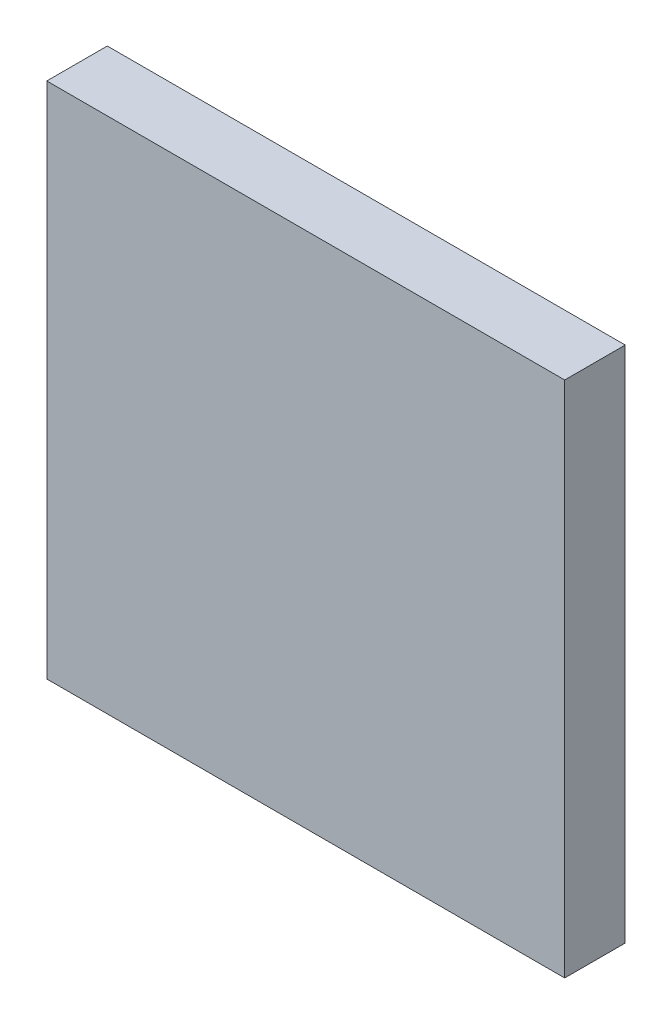
ISO-10303-21;
HEADER;
FILE_DESCRIPTION(('STEP AP214'),'2;1');
FILE_NAME('part.step','',(''),(''),'','','');
FILE_SCHEMA(('AUTOMOTIVE_DESIGN { 1 0 10303 214 1 1 1 1 }'));
ENDSEC;
DATA;
#1=APPLICATION_CONTEXT('core data for automotive mechanical design processes');
#2=APPLICATION_PROTOCOL_DEFINITION('international standard','automotive_design',2000,#1);
#3=PRODUCT_CONTEXT('',#1,'mechanical');
#4=PRODUCT('Part','Part','',(#3));
#5=PRODUCT_RELATED_PRODUCT_CATEGORY('part','',(#4));
#6=PRODUCT_DEFINITION_FORMATION('','',#4);
#7=PRODUCT_DEFINITION_CONTEXT('part definition',#1,'design');
#8=PRODUCT_DEFINITION('design','',#6,#7);
#9=PRODUCT_DEFINITION_SHAPE('','',#8);
#10=(LENGTH_UNIT() NAMED_UNIT(*) SI_UNIT(.MILLI.,.METRE.));
#11=(NAMED_UNIT(*) PLANE_ANGLE_UNIT() SI_UNIT($,.RADIAN.));
#12=(NAMED_UNIT(*) SI_UNIT($,.STERADIAN.) SOLID_ANGLE_UNIT());
#13=UNCERTAINTY_MEASURE_WITH_UNIT(LENGTH_MEASURE(1.E-05),#10,'distance_accuracy_value','');
#14=(GEOMETRIC_REPRESENTATION_CONTEXT(3) GLOBAL_UNCERTAINTY_ASSIGNED_CONTEXT((#13)) GLOBAL_UNIT_ASSIGNED_CONTEXT((#10,
#11,#12)) REPRESENTATION_CONTEXT('',''));
#15=CARTESIAN_POINT('',(0.,0.,0.));
#16=DIRECTION('',(0.,0.,1.));
#17=DIRECTION('',(1.,0.,0.));
#18=AXIS2_PLACEMENT_3D('',#15,#16,#17);
#19=CARTESIAN_POINT('',(-80.,-80.,1.7));
#20=DIRECTION('',(-1.,0.,0.));
#21=DIRECTION('',(0.,-1.,0.));
#22=AXIS2_PLACEMENT_3D('',#19,#20,#21);
#23=PLANE('',#22);
#24=DIRECTION('',(0.,1.,0.));
#25=VECTOR('',#24,1.);
#26=CARTESIAN_POINT('',(-80.,-80.,0.));
#27=LINE('',#26,#25);
#28=CARTESIAN_POINT('',(-80.,-80.,0.));
#29=VERTEX_POINT('',#28);
#30=CARTESIAN_POINT('',(-80.,80.,0.));
#31=VERTEX_POINT('',#30);
#32=EDGE_CURVE('E129',#29,#31,#27,.T.);
#33=ORIENTED_EDGE('',*,*,#32,.F.);
#34=DIRECTION('',(0.,0.,-1.));
#35=VECTOR('',#34,1.);
#36=CARTESIAN_POINT('',(-80.,-80.,1.7));
#37=LINE('',#36,#35);
#38=CARTESIAN_POINT('',(-80.,-80.,18.7));
#39=VERTEX_POINT('',#38);
#40=EDGE_CURVE('E11',#39,#29,#37,.T.);
#41=ORIENTED_EDGE('',*,*,#40,.F.);
#42=DIRECTION('',(0.,-1.,0.));
#43=VECTOR('',#42,1.);
#44=CARTESIAN_POINT('',(-80.,80.,18.7));
#45=LINE('',#44,#43);
#46=CARTESIAN_POINT('',(-80.,80.,18.7));
#47=VERTEX_POINT('',#46);
#48=EDGE_CURVE('E167',#47,#39,#45,.T.);
#49=ORIENTED_EDGE('',*,*,#48,.F.);
#50=DIRECTION('',(0.,0.,-1.));
#51=VECTOR('',#50,1.);
#52=CARTESIAN_POINT('',(-80.,80.,1.7));
#53=LINE('',#52,#51);
#54=EDGE_CURVE('E37',#47,#31,#53,.T.);
#55=ORIENTED_EDGE('',*,*,#54,.T.);
#56=EDGE_LOOP('',(#33,#41,#49,#55));
#57=FACE_BOUND('',#56,.T.);
#58=ADVANCED_FACE('F34',(#57),#23,.T.);
#59=CARTESIAN_POINT('',(-6.24999999999998,-80.,1.7));
#60=DIRECTION('',(0.,-1.,0.));
#61=DIRECTION('',(1.,0.,0.));
#62=AXIS2_PLACEMENT_3D('',#59,#60,#61);
#63=PLANE('',#62);
#64=DIRECTION('',(-1.,0.,0.));
#65=VECTOR('',#64,1.);
#66=CARTESIAN_POINT('',(-6.24999999999998,-80.,0.));
#67=LINE('',#66,#65);
#68=CARTESIAN_POINT('',(-6.24999999999998,-80.,0.));
#69=VERTEX_POINT('',#68);
#70=EDGE_CURVE('E96',#69,#29,#67,.T.);
#71=ORIENTED_EDGE('',*,*,#70,.F.);
#72=DIRECTION('',(0.,0.,-1.));
#73=VECTOR('',#72,1.);
#74=CARTESIAN_POINT('',(-6.24999999999998,-80.,1.7));
#75=LINE('',#74,#73);
#76=CARTESIAN_POINT('',(-6.24999999999996,-80.,1.7));
#77=VERTEX_POINT('',#76);
#78=EDGE_CURVE('E43',#77,#69,#75,.T.);
#79=ORIENTED_EDGE('',*,*,#78,.F.);
#80=DIRECTION('',(1.,0.,0.));
#81=VECTOR('',#80,1.);
#82=CARTESIAN_POINT('',(-80.,-80.,1.7));
#83=LINE('',#82,#81);
#84=CARTESIAN_POINT('',(6.25000000000002,-80.,1.7));
#85=VERTEX_POINT('',#84);
#86=EDGE_CURVE('E132',#77,#85,#83,.T.);
#87=ORIENTED_EDGE('',*,*,#86,.T.);
#88=DIRECTION('',(0.,0.,-1.));
#89=VECTOR('',#88,1.);
#90=CARTESIAN_POINT('',(6.25000000000002,-80.,1.7));
#91=LINE('',#90,#89);
#92=CARTESIAN_POINT('',(6.25000000000002,-80.,0.));
#93=VERTEX_POINT('',#92);
#94=EDGE_CURVE('E114',#85,#93,#91,.T.);
#95=ORIENTED_EDGE('',*,*,#94,.T.);
#96=DIRECTION('',(-1.,0.,0.));
#97=VECTOR('',#96,1.);
#98=CARTESIAN_POINT('',(80.,-80.,0.));
#99=LINE('',#98,#97);
#100=CARTESIAN_POINT('',(80.,-80.,0.));
#101=VERTEX_POINT('',#100);
#102=EDGE_CURVE('E138',#101,#93,#99,.T.);
#103=ORIENTED_EDGE('',*,*,#102,.F.);
#104=DIRECTION('',(0.,0.,-1.));
#105=VECTOR('',#104,1.);
#106=CARTESIAN_POINT('',(80.,-80.,1.7));
#107=LINE('',#106,#105);
#108=CARTESIAN_POINT('',(80.,-80.,18.7));
#109=VERTEX_POINT('',#108);
#110=EDGE_CURVE('E116',#109,#101,#107,.T.);
#111=ORIENTED_EDGE('',*,*,#110,.F.);
#112=DIRECTION('',(1.,0.,0.));
#113=VECTOR('',#112,1.);
#114=CARTESIAN_POINT('',(-80.,-80.,18.7));
#115=LINE('',#114,#113);
#116=EDGE_CURVE('E164',#39,#109,#115,.T.);
#117=ORIENTED_EDGE('',*,*,#116,.F.);
#118=ORIENTED_EDGE('',*,*,#40,.T.);
#119=EDGE_LOOP('',(#71,#79,#87,#95,#103,#111,#117,#118));
#120=FACE_BOUND('',#119,.T.);
#121=ADVANCED_FACE('F101',(#120),#63,.T.);
#122=CARTESIAN_POINT('',(-6.24999999999998,-75.7425738934188,1.7));
#123=DIRECTION('',(1.,0.,0.));
#124=DIRECTION('',(0.,0.,-1.));
#125=AXIS2_PLACEMENT_3D('',#122,#123,#124);
#126=PLANE('',#125);
#127=DIRECTION('',(0.,-1.,0.));
#128=VECTOR('',#127,1.);
#129=CARTESIAN_POINT('',(-6.24999999999998,-75.7425738934188,0.));
#130=LINE('',#129,#128);
#131=CARTESIAN_POINT('',(-6.24999999999994,-75.7425738934188,0.));
#132=VERTEX_POINT('',#131);
#133=EDGE_CURVE('E83',#132,#69,#130,.T.);
#134=ORIENTED_EDGE('',*,*,#133,.F.);
#135=DIRECTION('',(0.,0.,-1.));
#136=VECTOR('',#135,1.);
#137=CARTESIAN_POINT('',(-6.24999999999994,-75.7425738934188,1.7));
#138=LINE('',#137,#136);
#139=CARTESIAN_POINT('',(-6.24999999999998,-75.7425738934188,1.7));
#140=VERTEX_POINT('',#139);
#141=EDGE_CURVE('E89',#140,#132,#138,.T.);
#142=ORIENTED_EDGE('',*,*,#141,.F.);
#143=DIRECTION('',(0.,-1.,0.));
#144=VECTOR('',#143,1.);
#145=CARTESIAN_POINT('',(-6.24999999999998,-75.7425738934188,1.7));
#146=LINE('',#145,#144);
#147=EDGE_CURVE('E85',#140,#77,#146,.T.);
#148=ORIENTED_EDGE('',*,*,#147,.T.);
#149=ORIENTED_EDGE('',*,*,#78,.T.);
#150=EDGE_LOOP('',(#134,#142,#148,#149));
#151=FACE_BOUND('',#150,.T.);
#152=ADVANCED_FACE('F81',(#151),#126,.T.);
#153=CARTESIAN_POINT('',(0.,0.,1.7));
#154=DIRECTION('',(0.,0.,-1.));
#155=DIRECTION('',(-1.,0.,0.));
#156=AXIS2_PLACEMENT_3D('',#153,#154,#155);
#157=CYLINDRICAL_SURFACE('',#156,76.);
#158=CARTESIAN_POINT('',(0.,0.,0.));
#159=DIRECTION('',(0.,0.,-1.));
#160=DIRECTION('',(-1.,0.,0.));
#161=AXIS2_PLACEMENT_3D('',#158,#159,#160);
#162=CIRCLE('',#161,76.);
#163=CARTESIAN_POINT('',(6.25000000000002,-75.7425738934188,0.));
#164=VERTEX_POINT('',#163);
#165=EDGE_CURVE('E99',#132,#164,#162,.T.);
#166=ORIENTED_EDGE('',*,*,#165,.T.);
#167=DIRECTION('',(0.,0.,-1.));
#168=VECTOR('',#167,1.);
#169=CARTESIAN_POINT('',(6.25000000000002,-75.7425738934188,1.7));
#170=LINE('',#169,#168);
#171=CARTESIAN_POINT('',(6.25000000000002,-75.7425738934188,1.7));
#172=VERTEX_POINT('',#171);
#173=EDGE_CURVE('E112',#172,#164,#170,.T.);
#174=ORIENTED_EDGE('',*,*,#173,.F.);
#175=CARTESIAN_POINT('',(0.,0.,1.7));
#176=DIRECTION('',(0.,0.,1.));
#177=DIRECTION('',(1.,0.,0.));
#178=AXIS2_PLACEMENT_3D('',#175,#176,#177);
#179=CIRCLE('',#178,76.);
#180=EDGE_CURVE('E51',#140,#172,#179,.T.);
#181=ORIENTED_EDGE('',*,*,#180,.F.);
#182=ORIENTED_EDGE('',*,*,#141,.T.);
#183=EDGE_LOOP('',(#166,#174,#181,#182));
#184=FACE_BOUND('',#183,.T.);
#185=CARTESIAN_POINT('',(0.,0.,16.7));
#186=DIRECTION('',(0.,0.,1.));
#187=DIRECTION('',(1.,0.,0.));
#188=AXIS2_PLACEMENT_3D('',#185,#186,#187);
#189=CIRCLE('',#188,76.);
#190=CARTESIAN_POINT('',(76.,0.,16.7));
#191=VERTEX_POINT('',#190);
#192=EDGE_CURVE('E153',#191,#191,#189,.T.);
#193=ORIENTED_EDGE('',*,*,#192,.T.);
#194=EDGE_LOOP('',(#193));
#195=FACE_BOUND('',#194,.T.);
#196=ADVANCED_FACE('F143',(#184,#195),#157,.F.);
#197=CARTESIAN_POINT('',(6.25000000000002,-80.,1.7));
#198=DIRECTION('',(-1.,0.,0.));
#199=DIRECTION('',(0.,-1.,0.));
#200=AXIS2_PLACEMENT_3D('',#197,#198,#199);
#201=PLANE('',#200);
#202=DIRECTION('',(0.,1.,0.));
#203=VECTOR('',#202,1.);
#204=CARTESIAN_POINT('',(6.25000000000002,-80.,0.));
#205=LINE('',#204,#203);
#206=EDGE_CURVE('E141',#93,#164,#205,.T.);
#207=ORIENTED_EDGE('',*,*,#206,.F.);
#208=ORIENTED_EDGE('',*,*,#94,.F.);
#209=DIRECTION('',(0.,1.,0.));
#210=VECTOR('',#209,1.);
#211=CARTESIAN_POINT('',(6.25000000000002,-80.,1.7));
#212=LINE('',#211,#210);
#213=EDGE_CURVE('E105',#85,#172,#212,.T.);
#214=ORIENTED_EDGE('',*,*,#213,.T.);
#215=ORIENTED_EDGE('',*,*,#173,.T.);
#216=EDGE_LOOP('',(#207,#208,#214,#215));
#217=FACE_BOUND('',#216,.T.);
#218=ADVANCED_FACE('F149',(#217),#201,.T.);
#219=CARTESIAN_POINT('',(80.,80.,1.7));
#220=DIRECTION('',(1.,0.,0.));
#221=DIRECTION('',(0.,0.,-1.));
#222=AXIS2_PLACEMENT_3D('',#219,#220,#221);
#223=PLANE('',#222);
#224=DIRECTION('',(0.,-1.,0.));
#225=VECTOR('',#224,1.);
#226=CARTESIAN_POINT('',(80.,80.,0.));
#227=LINE('',#226,#225);
#228=CARTESIAN_POINT('',(80.,80.,0.));
#229=VERTEX_POINT('',#228);
#230=EDGE_CURVE('E135',#229,#101,#227,.T.);
#231=ORIENTED_EDGE('',*,*,#230,.F.);
#232=DIRECTION('',(0.,0.,-1.));
#233=VECTOR('',#232,1.);
#234=CARTESIAN_POINT('',(80.,80.,1.7));
#235=LINE('',#234,#233);
#236=CARTESIAN_POINT('',(80.,80.,18.7));
#237=VERTEX_POINT('',#236);
#238=EDGE_CURVE('E117',#237,#229,#235,.T.);
#239=ORIENTED_EDGE('',*,*,#238,.F.);
#240=DIRECTION('',(0.,1.,0.));
#241=VECTOR('',#240,1.);
#242=CARTESIAN_POINT('',(80.,80.,18.7));
#243=LINE('',#242,#241);
#244=EDGE_CURVE('E161',#109,#237,#243,.T.);
#245=ORIENTED_EDGE('',*,*,#244,.F.);
#246=ORIENTED_EDGE('',*,*,#110,.T.);
#247=EDGE_LOOP('',(#231,#239,#245,#246));
#248=FACE_BOUND('',#247,.T.);
#249=ADVANCED_FACE('F183',(#248),#223,.T.);
#250=CARTESIAN_POINT('',(-80.,80.,1.7));
#251=DIRECTION('',(0.,1.,0.));
#252=DIRECTION('',(0.,0.,1.));
#253=AXIS2_PLACEMENT_3D('',#250,#251,#252);
#254=PLANE('',#253);
#255=DIRECTION('',(1.,0.,0.));
#256=VECTOR('',#255,1.);
#257=CARTESIAN_POINT('',(-80.,80.,0.));
#258=LINE('',#257,#256);
#259=EDGE_CURVE('E131',#31,#229,#258,.T.);
#260=ORIENTED_EDGE('',*,*,#259,.F.);
#261=ORIENTED_EDGE('',*,*,#54,.F.);
#262=DIRECTION('',(-1.,0.,0.));
#263=VECTOR('',#262,1.);
#264=CARTESIAN_POINT('',(-80.,80.,18.7));
#265=LINE('',#264,#263);
#266=EDGE_CURVE('E158',#237,#47,#265,.T.);
#267=ORIENTED_EDGE('',*,*,#266,.F.);
#268=ORIENTED_EDGE('',*,*,#238,.T.);
#269=EDGE_LOOP('',(#260,#261,#267,#268));
#270=FACE_BOUND('',#269,.T.);
#271=ADVANCED_FACE('F184',(#270),#254,.T.);
#272=CARTESIAN_POINT('',(0.,0.,0.));
#273=DIRECTION('',(0.,0.,-1.));
#274=DIRECTION('',(-1.,0.,0.));
#275=AXIS2_PLACEMENT_3D('',#272,#273,#274);
#276=PLANE('',#275);
#277=ORIENTED_EDGE('',*,*,#32,.T.);
#278=ORIENTED_EDGE('',*,*,#259,.T.);
#279=ORIENTED_EDGE('',*,*,#230,.T.);
#280=ORIENTED_EDGE('',*,*,#102,.T.);
#281=ORIENTED_EDGE('',*,*,#206,.T.);
#282=ORIENTED_EDGE('',*,*,#165,.F.);
#283=ORIENTED_EDGE('',*,*,#133,.T.);
#284=ORIENTED_EDGE('',*,*,#70,.T.);
#285=EDGE_LOOP('',(#277,#278,#279,#280,#281,#282,#283,#284));
#286=FACE_BOUND('',#285,.T.);
#287=ADVANCED_FACE('F95',(#286),#276,.T.);
#288=CARTESIAN_POINT('',(0.,0.,1.7));
#289=DIRECTION('',(0.,0.,1.));
#290=DIRECTION('',(1.,0.,0.));
#291=AXIS2_PLACEMENT_3D('',#288,#289,#290);
#292=PLANE('',#291);
#293=ORIENTED_EDGE('',*,*,#147,.F.);
#294=ORIENTED_EDGE('',*,*,#180,.T.);
#295=ORIENTED_EDGE('',*,*,#213,.F.);
#296=ORIENTED_EDGE('',*,*,#86,.F.);
#297=EDGE_LOOP('',(#293,#294,#295,#296));
#298=FACE_BOUND('',#297,.T.);
#299=ADVANCED_FACE('F152',(#298),#292,.F.);
#300=CARTESIAN_POINT('',(0.,0.,16.7));
#301=DIRECTION('',(0.,0.,1.));
#302=DIRECTION('',(1.,0.,0.));
#303=AXIS2_PLACEMENT_3D('',#300,#301,#302);
#304=PLANE('',#303);
#305=ORIENTED_EDGE('',*,*,#192,.F.);
#306=EDGE_LOOP('',(#305));
#307=FACE_BOUND('',#306,.T.);
#308=ADVANCED_FACE('F229',(#307),#304,.F.);
#309=CARTESIAN_POINT('',(0.,0.,18.7));
#310=DIRECTION('',(0.,0.,1.));
#311=DIRECTION('',(1.,0.,0.));
#312=AXIS2_PLACEMENT_3D('',#309,#310,#311);
#313=PLANE('',#312);
#314=ORIENTED_EDGE('',*,*,#48,.T.);
#315=ORIENTED_EDGE('',*,*,#116,.T.);
#316=ORIENTED_EDGE('',*,*,#244,.T.);
#317=ORIENTED_EDGE('',*,*,#266,.T.);
#318=EDGE_LOOP('',(#314,#315,#316,#317));
#319=FACE_BOUND('',#318,.T.);
#320=ADVANCED_FACE('F171',(#319),#313,.T.);
#321=CLOSED_SHELL('',(#58,#121,#152,#196,#218,#249,#271,#287,#299,#308,#320));
#322=MANIFOLD_SOLID_BREP('B2',#321);
#323=ADVANCED_BREP_SHAPE_REPRESENTATION('',(#18,#322),#14);
#324=SHAPE_DEFINITION_REPRESENTATION(#9,#323);
ENDSEC;
END-ISO-10303-21;
